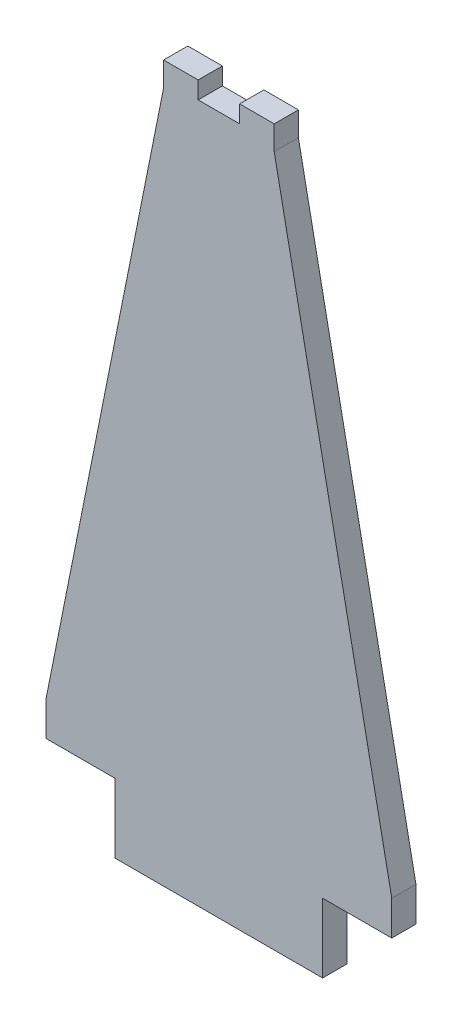
ISO-10303-21;
HEADER;
FILE_DESCRIPTION(('STEP AP214'),'2;1');
FILE_NAME('part.step','',(''),(''),'','','');
FILE_SCHEMA(('AUTOMOTIVE_DESIGN { 1 0 10303 214 1 1 1 1 }'));
ENDSEC;
DATA;
#1=APPLICATION_CONTEXT('core data for automotive mechanical design processes');
#2=APPLICATION_PROTOCOL_DEFINITION('international standard','automotive_design',2000,#1);
#3=PRODUCT_CONTEXT('',#1,'mechanical');
#4=PRODUCT('Part','Part','',(#3));
#5=PRODUCT_RELATED_PRODUCT_CATEGORY('part','',(#4));
#6=PRODUCT_DEFINITION_FORMATION('','',#4);
#7=PRODUCT_DEFINITION_CONTEXT('part definition',#1,'design');
#8=PRODUCT_DEFINITION('design','',#6,#7);
#9=PRODUCT_DEFINITION_SHAPE('','',#8);
#10=(LENGTH_UNIT() NAMED_UNIT(*) SI_UNIT(.MILLI.,.METRE.));
#11=(NAMED_UNIT(*) PLANE_ANGLE_UNIT() SI_UNIT($,.RADIAN.));
#12=(NAMED_UNIT(*) SI_UNIT($,.STERADIAN.) SOLID_ANGLE_UNIT());
#13=UNCERTAINTY_MEASURE_WITH_UNIT(LENGTH_MEASURE(1.E-05),#10,'distance_accuracy_value','');
#14=(GEOMETRIC_REPRESENTATION_CONTEXT(3) GLOBAL_UNCERTAINTY_ASSIGNED_CONTEXT((#13)) GLOBAL_UNIT_ASSIGNED_CONTEXT((#10,
#11,#12)) REPRESENTATION_CONTEXT('',''));
#15=CARTESIAN_POINT('',(0.,0.,0.));
#16=DIRECTION('',(0.,0.,1.));
#17=DIRECTION('',(1.,0.,0.));
#18=AXIS2_PLACEMENT_3D('',#15,#16,#17);
#19=CARTESIAN_POINT('',(0.,1.,0.175));
#20=DIRECTION('',(1.,0.,0.));
#21=DIRECTION('',(0.,1.,0.));
#22=AXIS2_PLACEMENT_3D('',#19,#20,#21);
#23=PLANE('',#22);
#24=DIRECTION('',(0.,-1.,0.));
#25=VECTOR('',#24,1.);
#26=CARTESIAN_POINT('',(0.,1.,-0.175));
#27=LINE('',#26,#25);
#28=CARTESIAN_POINT('',(0.,1.,-0.175));
#29=VERTEX_POINT('',#28);
#30=CARTESIAN_POINT('',(0.,0.,-0.175));
#31=VERTEX_POINT('',#30);
#32=EDGE_CURVE('E223',#29,#31,#27,.T.);
#33=ORIENTED_EDGE('',*,*,#32,.T.);
#34=DIRECTION('',(0.,0.,-1.));
#35=VECTOR('',#34,1.);
#36=CARTESIAN_POINT('',(0.,0.,0.175));
#37=LINE('',#36,#35);
#38=CARTESIAN_POINT('',(0.,0.,0.175));
#39=VERTEX_POINT('',#38);
#40=EDGE_CURVE('E11',#39,#31,#37,.T.);
#41=ORIENTED_EDGE('',*,*,#40,.F.);
#42=DIRECTION('',(0.,-1.,0.));
#43=VECTOR('',#42,1.);
#44=CARTESIAN_POINT('',(0.,1.,0.175));
#45=LINE('',#44,#43);
#46=CARTESIAN_POINT('',(0.,1.,0.175));
#47=VERTEX_POINT('',#46);
#48=EDGE_CURVE('E269',#47,#39,#45,.T.);
#49=ORIENTED_EDGE('',*,*,#48,.F.);
#50=DIRECTION('',(0.,0.,-1.));
#51=VECTOR('',#50,1.);
#52=CARTESIAN_POINT('',(0.,1.,0.175));
#53=LINE('',#52,#51);
#54=EDGE_CURVE('E219',#47,#29,#53,.T.);
#55=ORIENTED_EDGE('',*,*,#54,.T.);
#56=EDGE_LOOP('',(#33,#41,#49,#55));
#57=FACE_BOUND('',#56,.T.);
#58=ADVANCED_FACE('F45',(#57),#23,.F.);
#59=CARTESIAN_POINT('',(0.,0.,0.175));
#60=DIRECTION('',(0.,1.,0.));
#61=DIRECTION('',(-1.,0.,0.));
#62=AXIS2_PLACEMENT_3D('',#59,#60,#61);
#63=PLANE('',#62);
#64=DIRECTION('',(1.,0.,0.));
#65=VECTOR('',#64,1.);
#66=CARTESIAN_POINT('',(0.,0.,-0.175));
#67=LINE('',#66,#65);
#68=CARTESIAN_POINT('',(3.,0.,-0.175));
#69=VERTEX_POINT('',#68);
#70=EDGE_CURVE('E227',#31,#69,#67,.T.);
#71=ORIENTED_EDGE('',*,*,#70,.T.);
#72=DIRECTION('',(0.,0.,-1.));
#73=VECTOR('',#72,1.);
#74=CARTESIAN_POINT('',(3.,0.,0.175));
#75=LINE('',#74,#73);
#76=CARTESIAN_POINT('',(3.,0.,0.175));
#77=VERTEX_POINT('',#76);
#78=EDGE_CURVE('E54',#77,#69,#75,.T.);
#79=ORIENTED_EDGE('',*,*,#78,.F.);
#80=DIRECTION('',(1.,0.,0.));
#81=VECTOR('',#80,1.);
#82=CARTESIAN_POINT('',(0.,0.,0.175));
#83=LINE('',#82,#81);
#84=EDGE_CURVE('E149',#39,#77,#83,.T.);
#85=ORIENTED_EDGE('',*,*,#84,.F.);
#86=ORIENTED_EDGE('',*,*,#40,.T.);
#87=EDGE_LOOP('',(#71,#79,#85,#86));
#88=FACE_BOUND('',#87,.T.);
#89=ADVANCED_FACE('F391',(#88),#63,.F.);
#90=CARTESIAN_POINT('',(3.,0.,0.175));
#91=DIRECTION('',(-1.,0.,0.));
#92=DIRECTION('',(0.,0.,1.));
#93=AXIS2_PLACEMENT_3D('',#90,#91,#92);
#94=PLANE('',#93);
#95=DIRECTION('',(0.,1.,0.));
#96=VECTOR('',#95,1.);
#97=CARTESIAN_POINT('',(3.,0.,-0.175));
#98=LINE('',#97,#96);
#99=CARTESIAN_POINT('',(3.,1.,-0.175));
#100=VERTEX_POINT('',#99);
#101=EDGE_CURVE('E230',#69,#100,#98,.T.);
#102=ORIENTED_EDGE('',*,*,#101,.T.);
#103=DIRECTION('',(0.,0.,-1.));
#104=VECTOR('',#103,1.);
#105=CARTESIAN_POINT('',(3.,1.,0.175));
#106=LINE('',#105,#104);
#107=CARTESIAN_POINT('',(3.,1.,0.175));
#108=VERTEX_POINT('',#107);
#109=EDGE_CURVE('E312',#108,#100,#106,.T.);
#110=ORIENTED_EDGE('',*,*,#109,.F.);
#111=DIRECTION('',(0.,1.,0.));
#112=VECTOR('',#111,1.);
#113=CARTESIAN_POINT('',(3.,0.,0.175));
#114=LINE('',#113,#112);
#115=EDGE_CURVE('E322',#77,#108,#114,.T.);
#116=ORIENTED_EDGE('',*,*,#115,.F.);
#117=ORIENTED_EDGE('',*,*,#78,.T.);
#118=EDGE_LOOP('',(#102,#110,#116,#117));
#119=FACE_BOUND('',#118,.T.);
#120=ADVANCED_FACE('F320',(#119),#94,.F.);
#121=CARTESIAN_POINT('',(3.,1.,0.175));
#122=DIRECTION('',(0.,1.,0.));
#123=DIRECTION('',(-1.,0.,0.));
#124=AXIS2_PLACEMENT_3D('',#121,#122,#123);
#125=PLANE('',#124);
#126=DIRECTION('',(1.,0.,0.));
#127=VECTOR('',#126,1.);
#128=CARTESIAN_POINT('',(3.,1.,-0.175));
#129=LINE('',#128,#127);
#130=CARTESIAN_POINT('',(4.,1.,-0.175));
#131=VERTEX_POINT('',#130);
#132=EDGE_CURVE('E233',#100,#131,#129,.T.);
#133=ORIENTED_EDGE('',*,*,#132,.T.);
#134=DIRECTION('',(0.,0.,-1.));
#135=VECTOR('',#134,1.);
#136=CARTESIAN_POINT('',(4.,1.,0.175));
#137=LINE('',#136,#135);
#138=CARTESIAN_POINT('',(4.,1.,0.175));
#139=VERTEX_POINT('',#138);
#140=EDGE_CURVE('E308',#139,#131,#137,.T.);
#141=ORIENTED_EDGE('',*,*,#140,.F.);
#142=DIRECTION('',(1.,0.,0.));
#143=VECTOR('',#142,1.);
#144=CARTESIAN_POINT('',(3.,1.,0.175));
#145=LINE('',#144,#143);
#146=EDGE_CURVE('E341',#108,#139,#145,.T.);
#147=ORIENTED_EDGE('',*,*,#146,.F.);
#148=ORIENTED_EDGE('',*,*,#109,.T.);
#149=EDGE_LOOP('',(#133,#141,#147,#148));
#150=FACE_BOUND('',#149,.T.);
#151=ADVANCED_FACE('F331',(#150),#125,.F.);
#152=CARTESIAN_POINT('',(4.,1.,0.175));
#153=DIRECTION('',(-1.,0.,0.));
#154=DIRECTION('',(0.,0.,1.));
#155=AXIS2_PLACEMENT_3D('',#152,#153,#154);
#156=PLANE('',#155);
#157=DIRECTION('',(0.,1.,0.));
#158=VECTOR('',#157,1.);
#159=CARTESIAN_POINT('',(4.,1.,-0.175));
#160=LINE('',#159,#158);
#161=CARTESIAN_POINT('',(4.,1.5,-0.175));
#162=VERTEX_POINT('',#161);
#163=EDGE_CURVE('E236',#131,#162,#160,.T.);
#164=ORIENTED_EDGE('',*,*,#163,.T.);
#165=DIRECTION('',(0.,0.,-1.));
#166=VECTOR('',#165,1.);
#167=CARTESIAN_POINT('',(4.,1.5,0.175));
#168=LINE('',#167,#166);
#169=CARTESIAN_POINT('',(4.,1.5,0.175));
#170=VERTEX_POINT('',#169);
#171=EDGE_CURVE('E304',#170,#162,#168,.T.);
#172=ORIENTED_EDGE('',*,*,#171,.F.);
#173=DIRECTION('',(0.,1.,0.));
#174=VECTOR('',#173,1.);
#175=CARTESIAN_POINT('',(4.,1.,0.175));
#176=LINE('',#175,#174);
#177=EDGE_CURVE('E337',#139,#170,#176,.T.);
#178=ORIENTED_EDGE('',*,*,#177,.F.);
#179=ORIENTED_EDGE('',*,*,#140,.T.);
#180=EDGE_LOOP('',(#164,#172,#178,#179));
#181=FACE_BOUND('',#180,.T.);
#182=ADVANCED_FACE('F335',(#181),#156,.F.);
#183=CARTESIAN_POINT('',(4.,1.5,0.175));
#184=DIRECTION('',(-0.98058067569092,-0.196116135138184,0.));
#185=DIRECTION('',(0.196116135138184,-0.98058067569092,0.));
#186=AXIS2_PLACEMENT_3D('',#183,#184,#185);
#187=PLANE('',#186);
#188=DIRECTION('',(-0.196116135138184,0.98058067569092,0.));
#189=VECTOR('',#188,1.);
#190=CARTESIAN_POINT('',(4.,1.5,-0.175));
#191=LINE('',#190,#189);
#192=CARTESIAN_POINT('',(2.3,10.,-0.175));
#193=VERTEX_POINT('',#192);
#194=EDGE_CURVE('E239',#162,#193,#191,.T.);
#195=ORIENTED_EDGE('',*,*,#194,.T.);
#196=DIRECTION('',(0.,0.,-1.));
#197=VECTOR('',#196,1.);
#198=CARTESIAN_POINT('',(2.3,10.,0.175));
#199=LINE('',#198,#197);
#200=CARTESIAN_POINT('',(2.3,10.,0.175));
#201=VERTEX_POINT('',#200);
#202=EDGE_CURVE('E300',#201,#193,#199,.T.);
#203=ORIENTED_EDGE('',*,*,#202,.F.);
#204=DIRECTION('',(-0.196116135138184,0.98058067569092,0.));
#205=VECTOR('',#204,1.);
#206=CARTESIAN_POINT('',(4.,1.5,0.175));
#207=LINE('',#206,#205);
#208=EDGE_CURVE('E340',#170,#201,#207,.T.);
#209=ORIENTED_EDGE('',*,*,#208,.F.);
#210=ORIENTED_EDGE('',*,*,#171,.T.);
#211=EDGE_LOOP('',(#195,#203,#209,#210));
#212=FACE_BOUND('',#211,.T.);
#213=ADVANCED_FACE('F404',(#212),#187,.F.);
#214=CARTESIAN_POINT('',(2.3,10.,0.175));
#215=DIRECTION('',(-1.,0.,0.));
#216=DIRECTION('',(0.,0.,1.));
#217=AXIS2_PLACEMENT_3D('',#214,#215,#216);
#218=PLANE('',#217);
#219=DIRECTION('',(0.,1.,0.));
#220=VECTOR('',#219,1.);
#221=CARTESIAN_POINT('',(2.3,10.,-0.175));
#222=LINE('',#221,#220);
#223=CARTESIAN_POINT('',(2.3,10.35,-0.175));
#224=VERTEX_POINT('',#223);
#225=EDGE_CURVE('E242',#193,#224,#222,.T.);
#226=ORIENTED_EDGE('',*,*,#225,.T.);
#227=DIRECTION('',(0.,0.,-1.));
#228=VECTOR('',#227,1.);
#229=CARTESIAN_POINT('',(2.3,10.35,0.175));
#230=LINE('',#229,#228);
#231=CARTESIAN_POINT('',(2.3,10.35,0.175));
#232=VERTEX_POINT('',#231);
#233=EDGE_CURVE('E296',#232,#224,#230,.T.);
#234=ORIENTED_EDGE('',*,*,#233,.F.);
#235=DIRECTION('',(0.,1.,0.));
#236=VECTOR('',#235,1.);
#237=CARTESIAN_POINT('',(2.3,10.,0.175));
#238=LINE('',#237,#236);
#239=EDGE_CURVE('E345',#201,#232,#238,.T.);
#240=ORIENTED_EDGE('',*,*,#239,.F.);
#241=ORIENTED_EDGE('',*,*,#202,.T.);
#242=EDGE_LOOP('',(#226,#234,#240,#241));
#243=FACE_BOUND('',#242,.T.);
#244=ADVANCED_FACE('F407',(#243),#218,.F.);
#245=CARTESIAN_POINT('',(2.3,10.35,0.175));
#246=DIRECTION('',(0.,-1.,0.));
#247=DIRECTION('',(0.,0.,-1.));
#248=AXIS2_PLACEMENT_3D('',#245,#246,#247);
#249=PLANE('',#248);
#250=DIRECTION('',(-1.,0.,0.));
#251=VECTOR('',#250,1.);
#252=CARTESIAN_POINT('',(2.3,10.35,-0.175));
#253=LINE('',#252,#251);
#254=CARTESIAN_POINT('',(1.8,10.35,-0.175));
#255=VERTEX_POINT('',#254);
#256=EDGE_CURVE('E245',#224,#255,#253,.T.);
#257=ORIENTED_EDGE('',*,*,#256,.T.);
#258=DIRECTION('',(0.,0.,-1.));
#259=VECTOR('',#258,1.);
#260=CARTESIAN_POINT('',(1.8,10.35,0.175));
#261=LINE('',#260,#259);
#262=CARTESIAN_POINT('',(1.8,10.35,0.175));
#263=VERTEX_POINT('',#262);
#264=EDGE_CURVE('E292',#263,#255,#261,.T.);
#265=ORIENTED_EDGE('',*,*,#264,.F.);
#266=DIRECTION('',(-1.,0.,0.));
#267=VECTOR('',#266,1.);
#268=CARTESIAN_POINT('',(2.3,10.35,0.175));
#269=LINE('',#268,#267);
#270=EDGE_CURVE('E352',#232,#263,#269,.T.);
#271=ORIENTED_EDGE('',*,*,#270,.F.);
#272=ORIENTED_EDGE('',*,*,#233,.T.);
#273=EDGE_LOOP('',(#257,#265,#271,#272));
#274=FACE_BOUND('',#273,.T.);
#275=ADVANCED_FACE('F411',(#274),#249,.F.);
#276=CARTESIAN_POINT('',(1.8,10.35,0.175));
#277=DIRECTION('',(1.,0.,0.));
#278=DIRECTION('',(0.,1.,0.));
#279=AXIS2_PLACEMENT_3D('',#276,#277,#278);
#280=PLANE('',#279);
#281=DIRECTION('',(0.,-1.,0.));
#282=VECTOR('',#281,1.);
#283=CARTESIAN_POINT('',(1.8,10.35,-0.175));
#284=LINE('',#283,#282);
#285=CARTESIAN_POINT('',(1.8,10.1,-0.175));
#286=VERTEX_POINT('',#285);
#287=EDGE_CURVE('E248',#255,#286,#284,.T.);
#288=ORIENTED_EDGE('',*,*,#287,.T.);
#289=DIRECTION('',(0.,0.,-1.));
#290=VECTOR('',#289,1.);
#291=CARTESIAN_POINT('',(1.8,10.1,0.175));
#292=LINE('',#291,#290);
#293=CARTESIAN_POINT('',(1.8,10.1,0.175));
#294=VERTEX_POINT('',#293);
#295=EDGE_CURVE('E288',#294,#286,#292,.T.);
#296=ORIENTED_EDGE('',*,*,#295,.F.);
#297=DIRECTION('',(0.,-1.,0.));
#298=VECTOR('',#297,1.);
#299=CARTESIAN_POINT('',(1.8,10.35,0.175));
#300=LINE('',#299,#298);
#301=EDGE_CURVE('E355',#263,#294,#300,.T.);
#302=ORIENTED_EDGE('',*,*,#301,.F.);
#303=ORIENTED_EDGE('',*,*,#264,.T.);
#304=EDGE_LOOP('',(#288,#296,#302,#303));
#305=FACE_BOUND('',#304,.T.);
#306=ADVANCED_FACE('F415',(#305),#280,.F.);
#307=CARTESIAN_POINT('',(1.8,10.1,0.175));
#308=DIRECTION('',(0.,-1.,0.));
#309=DIRECTION('',(0.,0.,-1.));
#310=AXIS2_PLACEMENT_3D('',#307,#308,#309);
#311=PLANE('',#310);
#312=DIRECTION('',(-1.,0.,0.));
#313=VECTOR('',#312,1.);
#314=CARTESIAN_POINT('',(1.8,10.1,-0.175));
#315=LINE('',#314,#313);
#316=CARTESIAN_POINT('',(1.2,10.1,-0.175));
#317=VERTEX_POINT('',#316);
#318=EDGE_CURVE('E251',#286,#317,#315,.T.);
#319=ORIENTED_EDGE('',*,*,#318,.T.);
#320=DIRECTION('',(0.,0.,-1.));
#321=VECTOR('',#320,1.);
#322=CARTESIAN_POINT('',(1.2,10.1,0.175));
#323=LINE('',#322,#321);
#324=CARTESIAN_POINT('',(1.2,10.1,0.175));
#325=VERTEX_POINT('',#324);
#326=EDGE_CURVE('E284',#325,#317,#323,.T.);
#327=ORIENTED_EDGE('',*,*,#326,.F.);
#328=DIRECTION('',(-1.,0.,0.));
#329=VECTOR('',#328,1.);
#330=CARTESIAN_POINT('',(1.8,10.1,0.175));
#331=LINE('',#330,#329);
#332=EDGE_CURVE('E358',#294,#325,#331,.T.);
#333=ORIENTED_EDGE('',*,*,#332,.F.);
#334=ORIENTED_EDGE('',*,*,#295,.T.);
#335=EDGE_LOOP('',(#319,#327,#333,#334));
#336=FACE_BOUND('',#335,.T.);
#337=ADVANCED_FACE('F419',(#336),#311,.F.);
#338=CARTESIAN_POINT('',(1.2,10.1,0.175));
#339=DIRECTION('',(-1.,0.,0.));
#340=DIRECTION('',(0.,0.,1.));
#341=AXIS2_PLACEMENT_3D('',#338,#339,#340);
#342=PLANE('',#341);
#343=DIRECTION('',(0.,1.,0.));
#344=VECTOR('',#343,1.);
#345=CARTESIAN_POINT('',(1.2,10.1,-0.175));
#346=LINE('',#345,#344);
#347=CARTESIAN_POINT('',(1.2,10.35,-0.175));
#348=VERTEX_POINT('',#347);
#349=EDGE_CURVE('E254',#317,#348,#346,.T.);
#350=ORIENTED_EDGE('',*,*,#349,.T.);
#351=DIRECTION('',(0.,0.,-1.));
#352=VECTOR('',#351,1.);
#353=CARTESIAN_POINT('',(1.2,10.35,0.175));
#354=LINE('',#353,#352);
#355=CARTESIAN_POINT('',(1.2,10.35,0.175));
#356=VERTEX_POINT('',#355);
#357=EDGE_CURVE('E280',#356,#348,#354,.T.);
#358=ORIENTED_EDGE('',*,*,#357,.F.);
#359=DIRECTION('',(0.,1.,0.));
#360=VECTOR('',#359,1.);
#361=CARTESIAN_POINT('',(1.2,10.1,0.175));
#362=LINE('',#361,#360);
#363=EDGE_CURVE('E361',#325,#356,#362,.T.);
#364=ORIENTED_EDGE('',*,*,#363,.F.);
#365=ORIENTED_EDGE('',*,*,#326,.T.);
#366=EDGE_LOOP('',(#350,#358,#364,#365));
#367=FACE_BOUND('',#366,.T.);
#368=ADVANCED_FACE('F423',(#367),#342,.F.);
#369=CARTESIAN_POINT('',(1.2,10.35,0.175));
#370=DIRECTION('',(0.,-1.,0.));
#371=DIRECTION('',(0.,0.,-1.));
#372=AXIS2_PLACEMENT_3D('',#369,#370,#371);
#373=PLANE('',#372);
#374=DIRECTION('',(-1.,0.,0.));
#375=VECTOR('',#374,1.);
#376=CARTESIAN_POINT('',(1.2,10.35,-0.175));
#377=LINE('',#376,#375);
#378=CARTESIAN_POINT('',(0.699999999999999,10.35,-0.175));
#379=VERTEX_POINT('',#378);
#380=EDGE_CURVE('E257',#348,#379,#377,.T.);
#381=ORIENTED_EDGE('',*,*,#380,.T.);
#382=DIRECTION('',(0.,0.,-1.));
#383=VECTOR('',#382,1.);
#384=CARTESIAN_POINT('',(0.699999999999999,10.35,0.175));
#385=LINE('',#384,#383);
#386=CARTESIAN_POINT('',(0.699999999999999,10.35,0.175));
#387=VERTEX_POINT('',#386);
#388=EDGE_CURVE('E276',#387,#379,#385,.T.);
#389=ORIENTED_EDGE('',*,*,#388,.F.);
#390=DIRECTION('',(-1.,0.,0.));
#391=VECTOR('',#390,1.);
#392=CARTESIAN_POINT('',(1.2,10.35,0.175));
#393=LINE('',#392,#391);
#394=EDGE_CURVE('E364',#356,#387,#393,.T.);
#395=ORIENTED_EDGE('',*,*,#394,.F.);
#396=ORIENTED_EDGE('',*,*,#357,.T.);
#397=EDGE_LOOP('',(#381,#389,#395,#396));
#398=FACE_BOUND('',#397,.T.);
#399=ADVANCED_FACE('F372',(#398),#373,.F.);
#400=CARTESIAN_POINT('',(0.699999999999999,10.35,0.175));
#401=DIRECTION('',(1.,0.,0.));
#402=DIRECTION('',(0.,0.,-1.));
#403=AXIS2_PLACEMENT_3D('',#400,#401,#402);
#404=PLANE('',#403);
#405=DIRECTION('',(0.,-1.,0.));
#406=VECTOR('',#405,1.);
#407=CARTESIAN_POINT('',(0.699999999999999,10.35,-0.175));
#408=LINE('',#407,#406);
#409=CARTESIAN_POINT('',(0.699999999999999,10.,-0.175));
#410=VERTEX_POINT('',#409);
#411=EDGE_CURVE('E260',#379,#410,#408,.T.);
#412=ORIENTED_EDGE('',*,*,#411,.T.);
#413=DIRECTION('',(0.,0.,-1.));
#414=VECTOR('',#413,1.);
#415=CARTESIAN_POINT('',(0.699999999999999,10.,0.175));
#416=LINE('',#415,#414);
#417=CARTESIAN_POINT('',(0.699999999999999,10.,0.175));
#418=VERTEX_POINT('',#417);
#419=EDGE_CURVE('E212',#418,#410,#416,.T.);
#420=ORIENTED_EDGE('',*,*,#419,.F.);
#421=DIRECTION('',(0.,-1.,0.));
#422=VECTOR('',#421,1.);
#423=CARTESIAN_POINT('',(0.699999999999999,10.35,0.175));
#424=LINE('',#423,#422);
#425=EDGE_CURVE('E201',#387,#418,#424,.T.);
#426=ORIENTED_EDGE('',*,*,#425,.F.);
#427=ORIENTED_EDGE('',*,*,#388,.T.);
#428=EDGE_LOOP('',(#412,#420,#426,#427));
#429=FACE_BOUND('',#428,.T.);
#430=ADVANCED_FACE('F376',(#429),#404,.F.);
#431=CARTESIAN_POINT('',(0.699999999999999,10.,0.175));
#432=DIRECTION('',(0.98058067569092,-0.196116135138184,0.));
#433=DIRECTION('',(0.196116135138184,0.98058067569092,0.));
#434=AXIS2_PLACEMENT_3D('',#431,#432,#433);
#435=PLANE('',#434);
#436=DIRECTION('',(-0.196116135138184,-0.98058067569092,0.));
#437=VECTOR('',#436,1.);
#438=CARTESIAN_POINT('',(0.699999999999999,10.,-0.175));
#439=LINE('',#438,#437);
#440=CARTESIAN_POINT('',(-1.,1.5,-0.175));
#441=VERTEX_POINT('',#440);
#442=EDGE_CURVE('E210',#410,#441,#439,.T.);
#443=ORIENTED_EDGE('',*,*,#442,.T.);
#444=DIRECTION('',(0.,0.,-1.));
#445=VECTOR('',#444,1.);
#446=CARTESIAN_POINT('',(-1.,1.5,0.175));
#447=LINE('',#446,#445);
#448=CARTESIAN_POINT('',(-1.,1.5,0.175));
#449=VERTEX_POINT('',#448);
#450=EDGE_CURVE('E207',#449,#441,#447,.T.);
#451=ORIENTED_EDGE('',*,*,#450,.F.);
#452=DIRECTION('',(-0.196116135138184,-0.98058067569092,0.));
#453=VECTOR('',#452,1.);
#454=CARTESIAN_POINT('',(0.699999999999999,10.,0.175));
#455=LINE('',#454,#453);
#456=EDGE_CURVE('E195',#418,#449,#455,.T.);
#457=ORIENTED_EDGE('',*,*,#456,.F.);
#458=ORIENTED_EDGE('',*,*,#419,.T.);
#459=EDGE_LOOP('',(#443,#451,#457,#458));
#460=FACE_BOUND('',#459,.T.);
#461=ADVANCED_FACE('F208',(#460),#435,.F.);
#462=CARTESIAN_POINT('',(-1.,1.5,0.175));
#463=DIRECTION('',(1.,0.,0.));
#464=DIRECTION('',(0.,0.,-1.));
#465=AXIS2_PLACEMENT_3D('',#462,#463,#464);
#466=PLANE('',#465);
#467=DIRECTION('',(0.,-1.,0.));
#468=VECTOR('',#467,1.);
#469=CARTESIAN_POINT('',(-1.,1.5,-0.175));
#470=LINE('',#469,#468);
#471=CARTESIAN_POINT('',(-1.,1.,-0.175));
#472=VERTEX_POINT('',#471);
#473=EDGE_CURVE('E134',#441,#472,#470,.T.);
#474=ORIENTED_EDGE('',*,*,#473,.T.);
#475=DIRECTION('',(0.,0.,-1.));
#476=VECTOR('',#475,1.);
#477=CARTESIAN_POINT('',(-1.,1.,0.175));
#478=LINE('',#477,#476);
#479=CARTESIAN_POINT('',(-1.,1.,0.175));
#480=VERTEX_POINT('',#479);
#481=EDGE_CURVE('E213',#480,#472,#478,.T.);
#482=ORIENTED_EDGE('',*,*,#481,.F.);
#483=DIRECTION('',(0.,-1.,0.));
#484=VECTOR('',#483,1.);
#485=CARTESIAN_POINT('',(-1.,1.5,0.175));
#486=LINE('',#485,#484);
#487=EDGE_CURVE('E199',#449,#480,#486,.T.);
#488=ORIENTED_EDGE('',*,*,#487,.F.);
#489=ORIENTED_EDGE('',*,*,#450,.T.);
#490=EDGE_LOOP('',(#474,#482,#488,#489));
#491=FACE_BOUND('',#490,.T.);
#492=ADVANCED_FACE('F215',(#491),#466,.F.);
#493=CARTESIAN_POINT('',(-1.,1.,0.175));
#494=DIRECTION('',(0.,1.,0.));
#495=DIRECTION('',(-1.,0.,0.));
#496=AXIS2_PLACEMENT_3D('',#493,#494,#495);
#497=PLANE('',#496);
#498=DIRECTION('',(1.,0.,0.));
#499=VECTOR('',#498,1.);
#500=CARTESIAN_POINT('',(-1.,1.,-0.175));
#501=LINE('',#500,#499);
#502=EDGE_CURVE('E141',#472,#29,#501,.T.);
#503=ORIENTED_EDGE('',*,*,#502,.T.);
#504=ORIENTED_EDGE('',*,*,#54,.F.);
#505=DIRECTION('',(1.,0.,0.));
#506=VECTOR('',#505,1.);
#507=CARTESIAN_POINT('',(-1.,1.,0.175));
#508=LINE('',#507,#506);
#509=EDGE_CURVE('E65',#480,#47,#508,.T.);
#510=ORIENTED_EDGE('',*,*,#509,.F.);
#511=ORIENTED_EDGE('',*,*,#481,.T.);
#512=EDGE_LOOP('',(#503,#504,#510,#511));
#513=FACE_BOUND('',#512,.T.);
#514=ADVANCED_FACE('F380',(#513),#497,.F.);
#515=CARTESIAN_POINT('',(0.,0.,0.175));
#516=DIRECTION('',(0.,0.,1.));
#517=DIRECTION('',(1.,0.,0.));
#518=AXIS2_PLACEMENT_3D('',#515,#516,#517);
#519=PLANE('',#518);
#520=ORIENTED_EDGE('',*,*,#48,.T.);
#521=ORIENTED_EDGE('',*,*,#84,.T.);
#522=ORIENTED_EDGE('',*,*,#115,.T.);
#523=ORIENTED_EDGE('',*,*,#146,.T.);
#524=ORIENTED_EDGE('',*,*,#177,.T.);
#525=ORIENTED_EDGE('',*,*,#208,.T.);
#526=ORIENTED_EDGE('',*,*,#239,.T.);
#527=ORIENTED_EDGE('',*,*,#270,.T.);
#528=ORIENTED_EDGE('',*,*,#301,.T.);
#529=ORIENTED_EDGE('',*,*,#332,.T.);
#530=ORIENTED_EDGE('',*,*,#363,.T.);
#531=ORIENTED_EDGE('',*,*,#394,.T.);
#532=ORIENTED_EDGE('',*,*,#425,.T.);
#533=ORIENTED_EDGE('',*,*,#456,.T.);
#534=ORIENTED_EDGE('',*,*,#487,.T.);
#535=ORIENTED_EDGE('',*,*,#509,.T.);
#536=EDGE_LOOP('',(#520,#521,#522,#523,#524,#525,#526,#527,#528,#529,#530,#531,#532,#533,#534,#535));
#537=FACE_BOUND('',#536,.T.);
#538=ADVANCED_FACE('F197',(#537),#519,.T.);
#539=CARTESIAN_POINT('',(0.,0.,-0.175));
#540=DIRECTION('',(0.,0.,1.));
#541=DIRECTION('',(1.,0.,0.));
#542=AXIS2_PLACEMENT_3D('',#539,#540,#541);
#543=PLANE('',#542);
#544=ORIENTED_EDGE('',*,*,#32,.F.);
#545=ORIENTED_EDGE('',*,*,#502,.F.);
#546=ORIENTED_EDGE('',*,*,#473,.F.);
#547=ORIENTED_EDGE('',*,*,#442,.F.);
#548=ORIENTED_EDGE('',*,*,#411,.F.);
#549=ORIENTED_EDGE('',*,*,#380,.F.);
#550=ORIENTED_EDGE('',*,*,#349,.F.);
#551=ORIENTED_EDGE('',*,*,#318,.F.);
#552=ORIENTED_EDGE('',*,*,#287,.F.);
#553=ORIENTED_EDGE('',*,*,#256,.F.);
#554=ORIENTED_EDGE('',*,*,#225,.F.);
#555=ORIENTED_EDGE('',*,*,#194,.F.);
#556=ORIENTED_EDGE('',*,*,#163,.F.);
#557=ORIENTED_EDGE('',*,*,#132,.F.);
#558=ORIENTED_EDGE('',*,*,#101,.F.);
#559=ORIENTED_EDGE('',*,*,#70,.F.);
#560=EDGE_LOOP('',(#544,#545,#546,#547,#548,#549,#550,#551,#552,#553,#554,#555,#556,#557,#558,#559));
#561=FACE_BOUND('',#560,.T.);
#562=ADVANCED_FACE('F326',(#561),#543,.F.);
#563=CLOSED_SHELL('',(#58,#89,#120,#151,#182,#213,#244,#275,#306,#337,#368,#399,#430,#461,#492,
#514,#538,#562));
#564=MANIFOLD_SOLID_BREP('B2',#563);
#565=ADVANCED_BREP_SHAPE_REPRESENTATION('',(#18,#564),#14);
#566=SHAPE_DEFINITION_REPRESENTATION(#9,#565);
ENDSEC;
END-ISO-10303-21;
